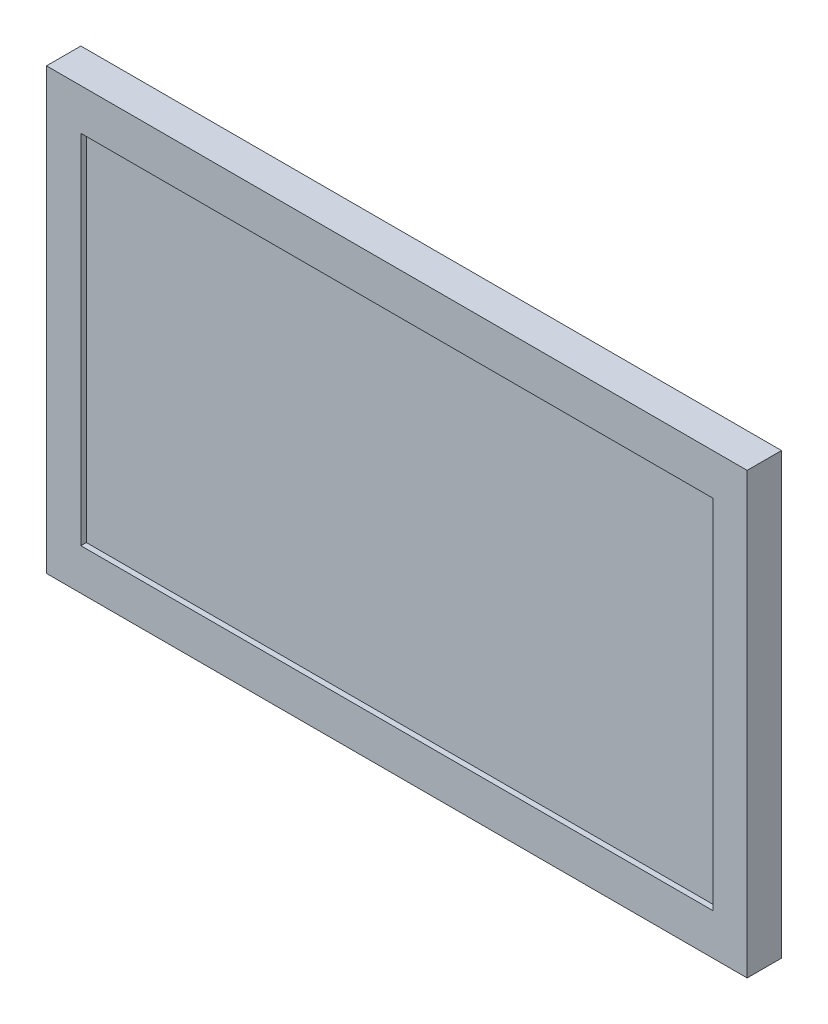
ISO-10303-21;
HEADER;
FILE_DESCRIPTION(('STEP AP214'),'2;1');
FILE_NAME('part.step','',(''),(''),'','','');
FILE_SCHEMA(('AUTOMOTIVE_DESIGN { 1 0 10303 214 1 1 1 1 }'));
ENDSEC;
DATA;
#1=APPLICATION_CONTEXT('core data for automotive mechanical design processes');
#2=APPLICATION_PROTOCOL_DEFINITION('international standard','automotive_design',2000,#1);
#3=PRODUCT_CONTEXT('',#1,'mechanical');
#4=PRODUCT('Part','Part','',(#3));
#5=PRODUCT_RELATED_PRODUCT_CATEGORY('part','',(#4));
#6=PRODUCT_DEFINITION_FORMATION('','',#4);
#7=PRODUCT_DEFINITION_CONTEXT('part definition',#1,'design');
#8=PRODUCT_DEFINITION('design','',#6,#7);
#9=PRODUCT_DEFINITION_SHAPE('','',#8);
#10=(LENGTH_UNIT() NAMED_UNIT(*) SI_UNIT(.MILLI.,.METRE.));
#11=(NAMED_UNIT(*) PLANE_ANGLE_UNIT() SI_UNIT($,.RADIAN.));
#12=(NAMED_UNIT(*) SI_UNIT($,.STERADIAN.) SOLID_ANGLE_UNIT());
#13=UNCERTAINTY_MEASURE_WITH_UNIT(LENGTH_MEASURE(1.E-05),#10,'distance_accuracy_value','');
#14=(GEOMETRIC_REPRESENTATION_CONTEXT(3) GLOBAL_UNCERTAINTY_ASSIGNED_CONTEXT((#13)) GLOBAL_UNIT_ASSIGNED_CONTEXT((#10,
#11,#12)) REPRESENTATION_CONTEXT('',''));
#15=CARTESIAN_POINT('',(0.,0.,0.));
#16=DIRECTION('',(0.,0.,1.));
#17=DIRECTION('',(1.,0.,0.));
#18=AXIS2_PLACEMENT_3D('',#15,#16,#17);
#19=CARTESIAN_POINT('',(161.925,-101.6,15.875));
#20=DIRECTION('',(-1.,0.,0.));
#21=DIRECTION('',(0.,0.,1.));
#22=AXIS2_PLACEMENT_3D('',#19,#20,#21);
#23=PLANE('',#22);
#24=DIRECTION('',(0.,1.,0.));
#25=VECTOR('',#24,1.);
#26=CARTESIAN_POINT('',(161.925,-101.6,0.));
#27=LINE('',#26,#25);
#28=CARTESIAN_POINT('',(161.925,-101.6,0.));
#29=VERTEX_POINT('',#28);
#30=CARTESIAN_POINT('',(161.925,101.6,0.));
#31=VERTEX_POINT('',#30);
#32=EDGE_CURVE('E164',#29,#31,#27,.T.);
#33=ORIENTED_EDGE('',*,*,#32,.T.);
#34=DIRECTION('',(0.,0.,-1.));
#35=VECTOR('',#34,1.);
#36=CARTESIAN_POINT('',(161.925,101.6,15.875));
#37=LINE('',#36,#35);
#38=CARTESIAN_POINT('',(161.925,101.6,15.875));
#39=VERTEX_POINT('',#38);
#40=EDGE_CURVE('E11',#39,#31,#37,.T.);
#41=ORIENTED_EDGE('',*,*,#40,.F.);
#42=DIRECTION('',(0.,1.,0.));
#43=VECTOR('',#42,1.);
#44=CARTESIAN_POINT('',(161.925,-101.6,15.875));
#45=LINE('',#44,#43);
#46=CARTESIAN_POINT('',(161.925,-101.6,15.875));
#47=VERTEX_POINT('',#46);
#48=EDGE_CURVE('E170',#47,#39,#45,.T.);
#49=ORIENTED_EDGE('',*,*,#48,.F.);
#50=DIRECTION('',(0.,0.,-1.));
#51=VECTOR('',#50,1.);
#52=CARTESIAN_POINT('',(161.925,-101.6,15.875));
#53=LINE('',#52,#51);
#54=EDGE_CURVE('E180',#47,#29,#53,.T.);
#55=ORIENTED_EDGE('',*,*,#54,.T.);
#56=EDGE_LOOP('',(#33,#41,#49,#55));
#57=FACE_BOUND('',#56,.T.);
#58=ADVANCED_FACE('F45',(#57),#23,.F.);
#59=CARTESIAN_POINT('',(-161.925,101.6,15.875));
#60=DIRECTION('',(0.,-1.,0.));
#61=DIRECTION('',(0.,0.,-1.));
#62=AXIS2_PLACEMENT_3D('',#59,#60,#61);
#63=PLANE('',#62);
#64=DIRECTION('',(-1.,0.,0.));
#65=VECTOR('',#64,1.);
#66=CARTESIAN_POINT('',(-161.925,101.6,0.));
#67=LINE('',#66,#65);
#68=CARTESIAN_POINT('',(-161.925,101.6,0.));
#69=VERTEX_POINT('',#68);
#70=EDGE_CURVE('E184',#31,#69,#67,.T.);
#71=ORIENTED_EDGE('',*,*,#70,.T.);
#72=DIRECTION('',(0.,0.,-1.));
#73=VECTOR('',#72,1.);
#74=CARTESIAN_POINT('',(-161.925,101.6,15.875));
#75=LINE('',#74,#73);
#76=CARTESIAN_POINT('',(-161.925,101.6,15.875));
#77=VERTEX_POINT('',#76);
#78=EDGE_CURVE('E53',#77,#69,#75,.T.);
#79=ORIENTED_EDGE('',*,*,#78,.F.);
#80=DIRECTION('',(-1.,0.,0.));
#81=VECTOR('',#80,1.);
#82=CARTESIAN_POINT('',(-161.925,101.6,15.875));
#83=LINE('',#82,#81);
#84=EDGE_CURVE('E97',#39,#77,#83,.T.);
#85=ORIENTED_EDGE('',*,*,#84,.F.);
#86=ORIENTED_EDGE('',*,*,#40,.T.);
#87=EDGE_LOOP('',(#71,#79,#85,#86));
#88=FACE_BOUND('',#87,.T.);
#89=ADVANCED_FACE('F219',(#88),#63,.F.);
#90=CARTESIAN_POINT('',(-161.925,-101.6,15.875));
#91=DIRECTION('',(1.,0.,0.));
#92=DIRECTION('',(0.,0.,-1.));
#93=AXIS2_PLACEMENT_3D('',#90,#91,#92);
#94=PLANE('',#93);
#95=DIRECTION('',(0.,-1.,0.));
#96=VECTOR('',#95,1.);
#97=CARTESIAN_POINT('',(-161.925,-101.6,0.));
#98=LINE('',#97,#96);
#99=CARTESIAN_POINT('',(-161.925,-101.6,0.));
#100=VERTEX_POINT('',#99);
#101=EDGE_CURVE('E187',#69,#100,#98,.T.);
#102=ORIENTED_EDGE('',*,*,#101,.T.);
#103=DIRECTION('',(0.,0.,-1.));
#104=VECTOR('',#103,1.);
#105=CARTESIAN_POINT('',(-161.925,-101.6,15.875));
#106=LINE('',#105,#104);
#107=CARTESIAN_POINT('',(-161.925,-101.6,15.875));
#108=VERTEX_POINT('',#107);
#109=EDGE_CURVE('E194',#108,#100,#106,.T.);
#110=ORIENTED_EDGE('',*,*,#109,.F.);
#111=DIRECTION('',(0.,-1.,0.));
#112=VECTOR('',#111,1.);
#113=CARTESIAN_POINT('',(-161.925,-101.6,15.875));
#114=LINE('',#113,#112);
#115=EDGE_CURVE('E175',#77,#108,#114,.T.);
#116=ORIENTED_EDGE('',*,*,#115,.F.);
#117=ORIENTED_EDGE('',*,*,#78,.T.);
#118=EDGE_LOOP('',(#102,#110,#116,#117));
#119=FACE_BOUND('',#118,.T.);
#120=ADVANCED_FACE('F201',(#119),#94,.F.);
#121=CARTESIAN_POINT('',(-161.925,-101.6,15.875));
#122=DIRECTION('',(0.,1.,0.));
#123=DIRECTION('',(0.,0.,1.));
#124=AXIS2_PLACEMENT_3D('',#121,#122,#123);
#125=PLANE('',#124);
#126=DIRECTION('',(1.,0.,0.));
#127=VECTOR('',#126,1.);
#128=CARTESIAN_POINT('',(-161.925,-101.6,0.));
#129=LINE('',#128,#127);
#130=EDGE_CURVE('E90',#100,#29,#129,.T.);
#131=ORIENTED_EDGE('',*,*,#130,.T.);
#132=ORIENTED_EDGE('',*,*,#54,.F.);
#133=DIRECTION('',(1.,0.,0.));
#134=VECTOR('',#133,1.);
#135=CARTESIAN_POINT('',(-161.925,-101.6,15.875));
#136=LINE('',#135,#134);
#137=EDGE_CURVE('E69',#108,#47,#136,.T.);
#138=ORIENTED_EDGE('',*,*,#137,.F.);
#139=ORIENTED_EDGE('',*,*,#109,.T.);
#140=EDGE_LOOP('',(#131,#132,#138,#139));
#141=FACE_BOUND('',#140,.T.);
#142=ADVANCED_FACE('F209',(#141),#125,.F.);
#143=CARTESIAN_POINT('',(0.,0.,15.875));
#144=DIRECTION('',(0.,0.,-1.));
#145=DIRECTION('',(-1.,0.,0.));
#146=AXIS2_PLACEMENT_3D('',#143,#144,#145);
#147=PLANE('',#146);
#148=DIRECTION('',(-1.,0.,0.));
#149=VECTOR('',#148,1.);
#150=CARTESIAN_POINT('',(-146.05,82.55,15.875));
#151=LINE('',#150,#149);
#152=CARTESIAN_POINT('',(146.05,82.55,15.875));
#153=VERTEX_POINT('',#152);
#154=CARTESIAN_POINT('',(-146.05,82.55,15.875));
#155=VERTEX_POINT('',#154);
#156=EDGE_CURVE('E155',#153,#155,#151,.T.);
#157=ORIENTED_EDGE('',*,*,#156,.F.);
#158=DIRECTION('',(0.,1.,0.));
#159=VECTOR('',#158,1.);
#160=CARTESIAN_POINT('',(146.05,-82.55,15.875));
#161=LINE('',#160,#159);
#162=CARTESIAN_POINT('',(146.05,-82.55,15.875));
#163=VERTEX_POINT('',#162);
#164=EDGE_CURVE('E60',#163,#153,#161,.T.);
#165=ORIENTED_EDGE('',*,*,#164,.F.);
#166=DIRECTION('',(1.,0.,0.));
#167=VECTOR('',#166,1.);
#168=CARTESIAN_POINT('',(-146.05,-82.55,15.875));
#169=LINE('',#168,#167);
#170=CARTESIAN_POINT('',(-146.05,-82.55,15.875));
#171=VERTEX_POINT('',#170);
#172=EDGE_CURVE('E142',#171,#163,#169,.T.);
#173=ORIENTED_EDGE('',*,*,#172,.F.);
#174=DIRECTION('',(0.,-1.,0.));
#175=VECTOR('',#174,1.);
#176=CARTESIAN_POINT('',(-146.05,-82.55,15.875));
#177=LINE('',#176,#175);
#178=EDGE_CURVE('E146',#155,#171,#177,.T.);
#179=ORIENTED_EDGE('',*,*,#178,.F.);
#180=EDGE_LOOP('',(#157,#165,#173,#179));
#181=FACE_BOUND('',#180,.T.);
#182=ORIENTED_EDGE('',*,*,#48,.T.);
#183=ORIENTED_EDGE('',*,*,#84,.T.);
#184=ORIENTED_EDGE('',*,*,#115,.T.);
#185=ORIENTED_EDGE('',*,*,#137,.T.);
#186=EDGE_LOOP('',(#182,#183,#184,#185));
#187=FACE_BOUND('',#186,.T.);
#188=ADVANCED_FACE('F211',(#181,#187),#147,.F.);
#189=CARTESIAN_POINT('',(0.,0.,0.));
#190=DIRECTION('',(0.,0.,-1.));
#191=DIRECTION('',(-1.,0.,0.));
#192=AXIS2_PLACEMENT_3D('',#189,#190,#191);
#193=PLANE('',#192);
#194=ORIENTED_EDGE('',*,*,#32,.F.);
#195=ORIENTED_EDGE('',*,*,#130,.F.);
#196=ORIENTED_EDGE('',*,*,#101,.F.);
#197=ORIENTED_EDGE('',*,*,#70,.F.);
#198=EDGE_LOOP('',(#194,#195,#196,#197));
#199=FACE_BOUND('',#198,.T.);
#200=ADVANCED_FACE('F205',(#199),#193,.T.);
#201=CARTESIAN_POINT('',(146.05,-82.55,13.335));
#202=DIRECTION('',(1.,0.,0.));
#203=DIRECTION('',(0.,0.,-1.));
#204=AXIS2_PLACEMENT_3D('',#201,#202,#203);
#205=PLANE('',#204);
#206=ORIENTED_EDGE('',*,*,#164,.T.);
#207=DIRECTION('',(0.,0.,1.));
#208=VECTOR('',#207,1.);
#209=CARTESIAN_POINT('',(146.05,82.55,13.335));
#210=LINE('',#209,#208);
#211=CARTESIAN_POINT('',(146.05,82.55,13.335));
#212=VERTEX_POINT('',#211);
#213=EDGE_CURVE('E117',#212,#153,#210,.T.);
#214=ORIENTED_EDGE('',*,*,#213,.F.);
#215=DIRECTION('',(0.,1.,0.));
#216=VECTOR('',#215,1.);
#217=CARTESIAN_POINT('',(146.05,-82.55,13.335));
#218=LINE('',#217,#216);
#219=CARTESIAN_POINT('',(146.05,-82.55,13.335));
#220=VERTEX_POINT('',#219);
#221=EDGE_CURVE('E121',#220,#212,#218,.T.);
#222=ORIENTED_EDGE('',*,*,#221,.F.);
#223=DIRECTION('',(0.,0.,1.));
#224=VECTOR('',#223,1.);
#225=CARTESIAN_POINT('',(146.05,-82.55,13.335));
#226=LINE('',#225,#224);
#227=EDGE_CURVE('E161',#220,#163,#226,.T.);
#228=ORIENTED_EDGE('',*,*,#227,.T.);
#229=EDGE_LOOP('',(#206,#214,#222,#228));
#230=FACE_BOUND('',#229,.T.);
#231=ADVANCED_FACE('F119',(#230),#205,.F.);
#232=CARTESIAN_POINT('',(-146.05,-82.55,13.335));
#233=DIRECTION('',(0.,-1.,0.));
#234=DIRECTION('',(0.,0.,-1.));
#235=AXIS2_PLACEMENT_3D('',#232,#233,#234);
#236=PLANE('',#235);
#237=ORIENTED_EDGE('',*,*,#172,.T.);
#238=ORIENTED_EDGE('',*,*,#227,.F.);
#239=DIRECTION('',(1.,0.,0.));
#240=VECTOR('',#239,1.);
#241=CARTESIAN_POINT('',(-146.05,-82.55,13.335));
#242=LINE('',#241,#240);
#243=CARTESIAN_POINT('',(-146.05,-82.55,13.335));
#244=VERTEX_POINT('',#243);
#245=EDGE_CURVE('E128',#244,#220,#242,.T.);
#246=ORIENTED_EDGE('',*,*,#245,.F.);
#247=DIRECTION('',(0.,0.,1.));
#248=VECTOR('',#247,1.);
#249=CARTESIAN_POINT('',(-146.05,-82.55,13.335));
#250=LINE('',#249,#248);
#251=EDGE_CURVE('E165',#244,#171,#250,.T.);
#252=ORIENTED_EDGE('',*,*,#251,.T.);
#253=EDGE_LOOP('',(#237,#238,#246,#252));
#254=FACE_BOUND('',#253,.T.);
#255=ADVANCED_FACE('F262',(#254),#236,.F.);
#256=CARTESIAN_POINT('',(-146.05,-82.55,13.335));
#257=DIRECTION('',(-1.,0.,0.));
#258=DIRECTION('',(0.,0.,1.));
#259=AXIS2_PLACEMENT_3D('',#256,#257,#258);
#260=PLANE('',#259);
#261=ORIENTED_EDGE('',*,*,#178,.T.);
#262=ORIENTED_EDGE('',*,*,#251,.F.);
#263=DIRECTION('',(0.,-1.,0.));
#264=VECTOR('',#263,1.);
#265=CARTESIAN_POINT('',(-146.05,-82.55,13.335));
#266=LINE('',#265,#264);
#267=CARTESIAN_POINT('',(-146.05,82.55,13.335));
#268=VERTEX_POINT('',#267);
#269=EDGE_CURVE('E137',#268,#244,#266,.T.);
#270=ORIENTED_EDGE('',*,*,#269,.F.);
#271=DIRECTION('',(0.,0.,1.));
#272=VECTOR('',#271,1.);
#273=CARTESIAN_POINT('',(-146.05,82.55,13.335));
#274=LINE('',#273,#272);
#275=EDGE_CURVE('E127',#268,#155,#274,.T.);
#276=ORIENTED_EDGE('',*,*,#275,.T.);
#277=EDGE_LOOP('',(#261,#262,#270,#276));
#278=FACE_BOUND('',#277,.T.);
#279=ADVANCED_FACE('F272',(#278),#260,.F.);
#280=CARTESIAN_POINT('',(-146.05,82.55,13.335));
#281=DIRECTION('',(0.,1.,0.));
#282=DIRECTION('',(0.,0.,1.));
#283=AXIS2_PLACEMENT_3D('',#280,#281,#282);
#284=PLANE('',#283);
#285=ORIENTED_EDGE('',*,*,#156,.T.);
#286=ORIENTED_EDGE('',*,*,#275,.F.);
#287=DIRECTION('',(-1.,0.,0.));
#288=VECTOR('',#287,1.);
#289=CARTESIAN_POINT('',(-146.05,82.55,13.335));
#290=LINE('',#289,#288);
#291=EDGE_CURVE('E131',#212,#268,#290,.T.);
#292=ORIENTED_EDGE('',*,*,#291,.F.);
#293=ORIENTED_EDGE('',*,*,#213,.T.);
#294=EDGE_LOOP('',(#285,#286,#292,#293));
#295=FACE_BOUND('',#294,.T.);
#296=ADVANCED_FACE('F132',(#295),#284,.F.);
#297=CARTESIAN_POINT('',(0.,0.,13.335));
#298=DIRECTION('',(0.,0.,-1.));
#299=DIRECTION('',(-1.,0.,0.));
#300=AXIS2_PLACEMENT_3D('',#297,#298,#299);
#301=PLANE('',#300);
#302=ORIENTED_EDGE('',*,*,#221,.T.);
#303=ORIENTED_EDGE('',*,*,#291,.T.);
#304=ORIENTED_EDGE('',*,*,#269,.T.);
#305=ORIENTED_EDGE('',*,*,#245,.T.);
#306=EDGE_LOOP('',(#302,#303,#304,#305));
#307=FACE_BOUND('',#306,.T.);
#308=ADVANCED_FACE('F139',(#307),#301,.F.);
#309=CLOSED_SHELL('',(#58,#89,#120,#142,#188,#200,#231,#255,#279,#296,#308));
#310=MANIFOLD_SOLID_BREP('B2',#309);
#311=ADVANCED_BREP_SHAPE_REPRESENTATION('',(#18,#310),#14);
#312=SHAPE_DEFINITION_REPRESENTATION(#9,#311);
ENDSEC;
END-ISO-10303-21;
